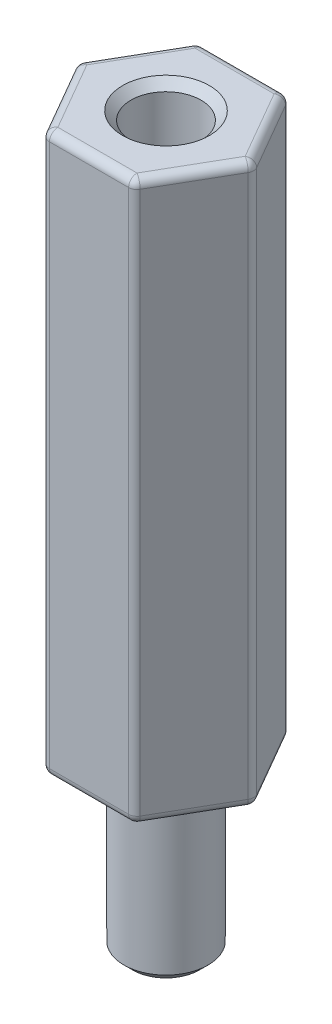
ISO-10303-21;
HEADER;
FILE_DESCRIPTION(('STEP AP214'),'2;1');
FILE_NAME('part.step','',(''),(''),'','','');
FILE_SCHEMA(('AUTOMOTIVE_DESIGN { 1 0 10303 214 1 1 1 1 }'));
ENDSEC;
DATA;
#1=APPLICATION_CONTEXT('core data for automotive mechanical design processes');
#2=APPLICATION_PROTOCOL_DEFINITION('international standard','automotive_design',2000,#1);
#3=PRODUCT_CONTEXT('',#1,'mechanical');
#4=PRODUCT('Part','Part','',(#3));
#5=PRODUCT_RELATED_PRODUCT_CATEGORY('part','',(#4));
#6=PRODUCT_DEFINITION_FORMATION('','',#4);
#7=PRODUCT_DEFINITION_CONTEXT('part definition',#1,'design');
#8=PRODUCT_DEFINITION('design','',#6,#7);
#9=PRODUCT_DEFINITION_SHAPE('','',#8);
#10=(LENGTH_UNIT() NAMED_UNIT(*) SI_UNIT(.MILLI.,.METRE.));
#11=(NAMED_UNIT(*) PLANE_ANGLE_UNIT() SI_UNIT($,.RADIAN.));
#12=(NAMED_UNIT(*) SI_UNIT($,.STERADIAN.) SOLID_ANGLE_UNIT());
#13=UNCERTAINTY_MEASURE_WITH_UNIT(LENGTH_MEASURE(1.E-05),#10,'distance_accuracy_value','');
#14=(GEOMETRIC_REPRESENTATION_CONTEXT(3) GLOBAL_UNCERTAINTY_ASSIGNED_CONTEXT((#13)) GLOBAL_UNIT_ASSIGNED_CONTEXT((#10,
#11,#12)) REPRESENTATION_CONTEXT('',''));
#15=CARTESIAN_POINT('',(0.,0.,0.));
#16=DIRECTION('',(0.,0.,1.));
#17=DIRECTION('',(1.,0.,0.));
#18=AXIS2_PLACEMENT_3D('',#15,#16,#17);
#19=CARTESIAN_POINT('',(0.,20.,0.));
#20=DIRECTION('',(0.,1.,0.));
#21=DIRECTION('',(0.,0.,1.));
#22=AXIS2_PLACEMENT_3D('',#19,#20,#21);
#23=PLANE('',#22);
#24=CARTESIAN_POINT('',(0.,20.,0.));
#25=DIRECTION('',(0.,1.,0.));
#26=DIRECTION('',(0.,0.,1.));
#27=AXIS2_PLACEMENT_3D('',#24,#25,#26);
#28=CIRCLE('',#27,1.55);
#29=CARTESIAN_POINT('',(0.,20.,1.55));
#30=VERTEX_POINT('',#29);
#31=EDGE_CURVE('E288',#30,#30,#28,.F.);
#32=ORIENTED_EDGE('',*,*,#31,.T.);
#33=EDGE_LOOP('',(#32));
#34=FACE_BOUND('',#33,.T.);
#35=DIRECTION('',(-0.5,0.,0.866025403784439));
#36=VECTOR('',#35,1.);
#37=CARTESIAN_POINT('',(-2.82901631902917,20.,0.));
#38=LINE('',#37,#36);
#39=CARTESIAN_POINT('',(-1.41450815951458,20.,-2.45));
#40=VERTEX_POINT('',#39);
#41=CARTESIAN_POINT('',(-2.82901631902917,20.,0.));
#42=VERTEX_POINT('',#41);
#43=EDGE_CURVE('E62',#40,#42,#38,.T.);
#44=ORIENTED_EDGE('',*,*,#43,.T.);
#45=DIRECTION('',(0.5,0.,0.866025403784439));
#46=VECTOR('',#45,1.);
#47=CARTESIAN_POINT('',(-1.41450815951458,20.,2.45));
#48=LINE('',#47,#46);
#49=CARTESIAN_POINT('',(-1.41450815951458,20.,2.45));
#50=VERTEX_POINT('',#49);
#51=EDGE_CURVE('E571',#42,#50,#48,.T.);
#52=ORIENTED_EDGE('',*,*,#51,.T.);
#53=DIRECTION('',(1.,0.,0.));
#54=VECTOR('',#53,1.);
#55=CARTESIAN_POINT('',(1.41450815951458,20.,2.45));
#56=LINE('',#55,#54);
#57=CARTESIAN_POINT('',(1.41450815951458,20.,2.45));
#58=VERTEX_POINT('',#57);
#59=EDGE_CURVE('E563',#50,#58,#56,.T.);
#60=ORIENTED_EDGE('',*,*,#59,.T.);
#61=DIRECTION('',(0.5,0.,-0.866025403784439));
#62=VECTOR('',#61,1.);
#63=CARTESIAN_POINT('',(2.82901631902917,20.,0.));
#64=LINE('',#63,#62);
#65=CARTESIAN_POINT('',(2.82901631902917,20.,0.));
#66=VERTEX_POINT('',#65);
#67=EDGE_CURVE('E565',#58,#66,#64,.T.);
#68=ORIENTED_EDGE('',*,*,#67,.T.);
#69=DIRECTION('',(-0.5,0.,-0.866025403784439));
#70=VECTOR('',#69,1.);
#71=CARTESIAN_POINT('',(1.41450815951459,20.,-2.45));
#72=LINE('',#71,#70);
#73=CARTESIAN_POINT('',(1.41450815951459,20.,-2.45));
#74=VERTEX_POINT('',#73);
#75=EDGE_CURVE('E567',#66,#74,#72,.T.);
#76=ORIENTED_EDGE('',*,*,#75,.T.);
#77=DIRECTION('',(-1.,0.,0.));
#78=VECTOR('',#77,1.);
#79=CARTESIAN_POINT('',(-1.41450815951458,20.,-2.45));
#80=LINE('',#79,#78);
#81=EDGE_CURVE('E67',#74,#40,#80,.T.);
#82=ORIENTED_EDGE('',*,*,#81,.T.);
#83=EDGE_LOOP('',(#44,#52,#60,#68,#76,#82));
#84=FACE_BOUND('',#83,.T.);
#85=ADVANCED_FACE('F47',(#34,#84),#23,.T.);
#86=CARTESIAN_POINT('',(0.,0.,0.));
#87=DIRECTION('',(0.,1.,0.));
#88=DIRECTION('',(0.,0.,1.));
#89=AXIS2_PLACEMENT_3D('',#86,#87,#88);
#90=PLANE('',#89);
#91=CARTESIAN_POINT('',(0.,0.,0.));
#92=DIRECTION('',(0.,1.,0.));
#93=DIRECTION('',(0.,0.,1.));
#94=AXIS2_PLACEMENT_3D('',#91,#92,#93);
#95=CIRCLE('',#94,1.8);
#96=CARTESIAN_POINT('',(0.,0.,1.8));
#97=VERTEX_POINT('',#96);
#98=EDGE_CURVE('E11',#97,#97,#95,.T.);
#99=ORIENTED_EDGE('',*,*,#98,.T.);
#100=EDGE_LOOP('',(#99));
#101=FACE_BOUND('',#100,.T.);
#102=DIRECTION('',(1.,0.,0.));
#103=VECTOR('',#102,1.);
#104=CARTESIAN_POINT('',(0.,0.,2.45));
#105=LINE('',#104,#103);
#106=CARTESIAN_POINT('',(1.41450815951458,0.,2.45));
#107=VERTEX_POINT('',#106);
#108=CARTESIAN_POINT('',(-1.41450815951458,0.,2.45));
#109=VERTEX_POINT('',#108);
#110=EDGE_CURVE('E182',#107,#109,#105,.F.);
#111=ORIENTED_EDGE('',*,*,#110,.T.);
#112=DIRECTION('',(0.5,0.,0.866025403784439));
#113=VECTOR('',#112,1.);
#114=CARTESIAN_POINT('',(-2.12176223927187,0.,1.225));
#115=LINE('',#114,#113);
#116=CARTESIAN_POINT('',(-2.82901631902917,0.,0.));
#117=VERTEX_POINT('',#116);
#118=EDGE_CURVE('E208',#109,#117,#115,.F.);
#119=ORIENTED_EDGE('',*,*,#118,.T.);
#120=DIRECTION('',(-0.5,0.,0.866025403784439));
#121=VECTOR('',#120,1.);
#122=CARTESIAN_POINT('',(-2.12176223927187,0.,-1.225));
#123=LINE('',#122,#121);
#124=CARTESIAN_POINT('',(-1.41450815951458,0.,-2.45));
#125=VERTEX_POINT('',#124);
#126=EDGE_CURVE('E524',#117,#125,#123,.F.);
#127=ORIENTED_EDGE('',*,*,#126,.T.);
#128=DIRECTION('',(-1.,0.,0.));
#129=VECTOR('',#128,1.);
#130=CARTESIAN_POINT('',(0.,0.,-2.45));
#131=LINE('',#130,#129);
#132=CARTESIAN_POINT('',(1.41450815951458,0.,-2.45));
#133=VERTEX_POINT('',#132);
#134=EDGE_CURVE('E522',#125,#133,#131,.F.);
#135=ORIENTED_EDGE('',*,*,#134,.T.);
#136=DIRECTION('',(-0.5,0.,-0.866025403784439));
#137=VECTOR('',#136,1.);
#138=CARTESIAN_POINT('',(2.12176223927188,0.,-1.225));
#139=LINE('',#138,#137);
#140=CARTESIAN_POINT('',(2.82901631902917,0.,0.));
#141=VERTEX_POINT('',#140);
#142=EDGE_CURVE('E520',#133,#141,#139,.F.);
#143=ORIENTED_EDGE('',*,*,#142,.T.);
#144=DIRECTION('',(0.5,0.,-0.866025403784439));
#145=VECTOR('',#144,1.);
#146=CARTESIAN_POINT('',(2.12176223927187,0.,1.225));
#147=LINE('',#146,#145);
#148=EDGE_CURVE('E518',#141,#107,#147,.F.);
#149=ORIENTED_EDGE('',*,*,#148,.T.);
#150=EDGE_LOOP('',(#111,#119,#127,#135,#143,#149));
#151=FACE_BOUND('',#150,.T.);
#152=ADVANCED_FACE('F307',(#101,#151),#90,.F.);
#153=CARTESIAN_POINT('',(1.58771324027147,20.,-2.75));
#154=DIRECTION('',(0.,0.,1.));
#155=DIRECTION('',(1.,0.,0.));
#156=AXIS2_PLACEMENT_3D('',#153,#154,#155);
#157=PLANE('',#156);
#158=DIRECTION('',(0.,-1.,0.));
#159=VECTOR('',#158,1.);
#160=CARTESIAN_POINT('',(1.41450815951458,20.,-2.75));
#161=LINE('',#160,#159);
#162=CARTESIAN_POINT('',(1.41450815951458,19.7,-2.75));
#163=VERTEX_POINT('',#162);
#164=CARTESIAN_POINT('',(1.41450815951458,0.300000000000002,-2.75));
#165=VERTEX_POINT('',#164);
#166=EDGE_CURVE('E487',#163,#165,#161,.T.);
#167=ORIENTED_EDGE('',*,*,#166,.T.);
#168=DIRECTION('',(-1.,0.,0.));
#169=VECTOR('',#168,1.);
#170=CARTESIAN_POINT('',(1.58771324027147,0.300000000000002,-2.75));
#171=LINE('',#170,#169);
#172=CARTESIAN_POINT('',(-1.41450815951458,0.300000000000002,-2.75));
#173=VERTEX_POINT('',#172);
#174=EDGE_CURVE('E541',#165,#173,#171,.T.);
#175=ORIENTED_EDGE('',*,*,#174,.T.);
#176=DIRECTION('',(0.,-1.,0.));
#177=VECTOR('',#176,1.);
#178=CARTESIAN_POINT('',(-1.41450815951458,20.,-2.75));
#179=LINE('',#178,#177);
#180=CARTESIAN_POINT('',(-1.41450815951458,19.7,-2.75));
#181=VERTEX_POINT('',#180);
#182=EDGE_CURVE('E484',#173,#181,#179,.F.);
#183=ORIENTED_EDGE('',*,*,#182,.T.);
#184=DIRECTION('',(-1.,0.,0.));
#185=VECTOR('',#184,1.);
#186=CARTESIAN_POINT('',(1.41450815951458,19.7,-2.75));
#187=LINE('',#186,#185);
#188=EDGE_CURVE('E539',#181,#163,#187,.F.);
#189=ORIENTED_EDGE('',*,*,#188,.T.);
#190=EDGE_LOOP('',(#167,#175,#183,#189));
#191=FACE_BOUND('',#190,.T.);
#192=ADVANCED_FACE('F315',(#191),#157,.F.);
#193=CARTESIAN_POINT('',(-1.58771324027147,20.,-2.75));
#194=DIRECTION('',(0.866025403784439,0.,0.5));
#195=DIRECTION('',(0.5,0.,-0.866025403784439));
#196=AXIS2_PLACEMENT_3D('',#193,#194,#195);
#197=PLANE('',#196);
#198=DIRECTION('',(0.,-1.,0.));
#199=VECTOR('',#198,1.);
#200=CARTESIAN_POINT('',(-1.67431578064991,20.,-2.6));
#201=LINE('',#200,#199);
#202=CARTESIAN_POINT('',(-1.67431578064991,19.7,-2.6));
#203=VERTEX_POINT('',#202);
#204=CARTESIAN_POINT('',(-1.67431578064991,0.300000000000002,-2.6));
#205=VERTEX_POINT('',#204);
#206=EDGE_CURVE('E195',#203,#205,#201,.T.);
#207=ORIENTED_EDGE('',*,*,#206,.T.);
#208=DIRECTION('',(-0.5,0.,0.866025403784439));
#209=VECTOR('',#208,1.);
#210=CARTESIAN_POINT('',(-1.58771324027147,0.300000000000002,-2.75));
#211=LINE('',#210,#209);
#212=CARTESIAN_POINT('',(-3.0888239401645,0.300000000000002,-0.15));
#213=VERTEX_POINT('',#212);
#214=EDGE_CURVE('E533',#205,#213,#211,.T.);
#215=ORIENTED_EDGE('',*,*,#214,.T.);
#216=DIRECTION('',(0.,-1.,0.));
#217=VECTOR('',#216,1.);
#218=CARTESIAN_POINT('',(-3.0888239401645,20.,-0.15));
#219=LINE('',#218,#217);
#220=CARTESIAN_POINT('',(-3.0888239401645,19.7,-0.15));
#221=VERTEX_POINT('',#220);
#222=EDGE_CURVE('E504',#213,#221,#219,.F.);
#223=ORIENTED_EDGE('',*,*,#222,.T.);
#224=DIRECTION('',(-0.5,0.,0.866025403784439));
#225=VECTOR('',#224,1.);
#226=CARTESIAN_POINT('',(-1.67431578064991,19.7,-2.6));
#227=LINE('',#226,#225);
#228=EDGE_CURVE('E531',#221,#203,#227,.F.);
#229=ORIENTED_EDGE('',*,*,#228,.T.);
#230=EDGE_LOOP('',(#207,#215,#223,#229));
#231=FACE_BOUND('',#230,.T.);
#232=ADVANCED_FACE('F336',(#231),#197,.F.);
#233=CARTESIAN_POINT('',(-3.17542648054294,20.,0.));
#234=DIRECTION('',(0.866025403784439,0.,-0.5));
#235=DIRECTION('',(-0.5,0.,-0.866025403784439));
#236=AXIS2_PLACEMENT_3D('',#233,#234,#235);
#237=PLANE('',#236);
#238=DIRECTION('',(0.,-1.,0.));
#239=VECTOR('',#238,1.);
#240=CARTESIAN_POINT('',(-3.0888239401645,20.,0.149999999999999));
#241=LINE('',#240,#239);
#242=CARTESIAN_POINT('',(-3.0888239401645,19.7,0.149999999999999));
#243=VERTEX_POINT('',#242);
#244=CARTESIAN_POINT('',(-3.0888239401645,0.300000000000002,0.149999999999999));
#245=VERTEX_POINT('',#244);
#246=EDGE_CURVE('E178',#243,#245,#241,.T.);
#247=ORIENTED_EDGE('',*,*,#246,.T.);
#248=DIRECTION('',(0.5,0.,0.866025403784439));
#249=VECTOR('',#248,1.);
#250=CARTESIAN_POINT('',(-3.17542648054294,0.300000000000002,0.));
#251=LINE('',#250,#249);
#252=CARTESIAN_POINT('',(-1.67431578064992,0.300000000000002,2.6));
#253=VERTEX_POINT('',#252);
#254=EDGE_CURVE('E173',#245,#253,#251,.T.);
#255=ORIENTED_EDGE('',*,*,#254,.T.);
#256=DIRECTION('',(0.,-1.,0.));
#257=VECTOR('',#256,1.);
#258=CARTESIAN_POINT('',(-1.67431578064992,20.,2.6));
#259=LINE('',#258,#257);
#260=CARTESIAN_POINT('',(-1.67431578064992,19.7,2.6));
#261=VERTEX_POINT('',#260);
#262=EDGE_CURVE('E176',#253,#261,#259,.F.);
#263=ORIENTED_EDGE('',*,*,#262,.T.);
#264=DIRECTION('',(0.5,0.,0.866025403784439));
#265=VECTOR('',#264,1.);
#266=CARTESIAN_POINT('',(-3.0888239401645,19.7,0.149999999999999));
#267=LINE('',#266,#265);
#268=EDGE_CURVE('E183',#261,#243,#267,.F.);
#269=ORIENTED_EDGE('',*,*,#268,.T.);
#270=EDGE_LOOP('',(#247,#255,#263,#269));
#271=FACE_BOUND('',#270,.T.);
#272=ADVANCED_FACE('F175',(#271),#237,.F.);
#273=CARTESIAN_POINT('',(-1.58771324027147,20.,2.75));
#274=DIRECTION('',(0.,0.,-1.));
#275=DIRECTION('',(-1.,0.,0.));
#276=AXIS2_PLACEMENT_3D('',#273,#274,#275);
#277=PLANE('',#276);
#278=DIRECTION('',(0.,-1.,0.));
#279=VECTOR('',#278,1.);
#280=CARTESIAN_POINT('',(-1.41450815951458,20.,2.75));
#281=LINE('',#280,#279);
#282=CARTESIAN_POINT('',(-1.41450815951458,19.7,2.75));
#283=VERTEX_POINT('',#282);
#284=CARTESIAN_POINT('',(-1.41450815951458,0.300000000000002,2.75));
#285=VERTEX_POINT('',#284);
#286=EDGE_CURVE('E513',#283,#285,#281,.T.);
#287=ORIENTED_EDGE('',*,*,#286,.T.);
#288=DIRECTION('',(1.,0.,0.));
#289=VECTOR('',#288,1.);
#290=CARTESIAN_POINT('',(-1.58771324027147,0.300000000000002,2.75));
#291=LINE('',#290,#289);
#292=CARTESIAN_POINT('',(1.41450815951458,0.300000000000002,2.75));
#293=VERTEX_POINT('',#292);
#294=EDGE_CURVE('E217',#285,#293,#291,.T.);
#295=ORIENTED_EDGE('',*,*,#294,.T.);
#296=DIRECTION('',(0.,-1.,0.));
#297=VECTOR('',#296,1.);
#298=CARTESIAN_POINT('',(1.41450815951458,20.,2.75));
#299=LINE('',#298,#297);
#300=CARTESIAN_POINT('',(1.41450815951458,19.7,2.75));
#301=VERTEX_POINT('',#300);
#302=EDGE_CURVE('E510',#293,#301,#299,.F.);
#303=ORIENTED_EDGE('',*,*,#302,.T.);
#304=DIRECTION('',(1.,0.,0.));
#305=VECTOR('',#304,1.);
#306=CARTESIAN_POINT('',(-1.41450815951458,19.7,2.75));
#307=LINE('',#306,#305);
#308=EDGE_CURVE('E572',#301,#283,#307,.F.);
#309=ORIENTED_EDGE('',*,*,#308,.T.);
#310=EDGE_LOOP('',(#287,#295,#303,#309));
#311=FACE_BOUND('',#310,.T.);
#312=ADVANCED_FACE('F329',(#311),#277,.F.);
#313=CARTESIAN_POINT('',(1.58771324027147,20.,2.75));
#314=DIRECTION('',(-0.866025403784439,0.,-0.5));
#315=DIRECTION('',(-0.5,0.,0.866025403784439));
#316=AXIS2_PLACEMENT_3D('',#313,#314,#315);
#317=PLANE('',#316);
#318=DIRECTION('',(0.,-1.,0.));
#319=VECTOR('',#318,1.);
#320=CARTESIAN_POINT('',(1.67431578064991,20.,2.6));
#321=LINE('',#320,#319);
#322=CARTESIAN_POINT('',(1.67431578064991,19.7,2.6));
#323=VERTEX_POINT('',#322);
#324=CARTESIAN_POINT('',(1.67431578064991,0.300000000000002,2.6));
#325=VERTEX_POINT('',#324);
#326=EDGE_CURVE('E498',#323,#325,#321,.T.);
#327=ORIENTED_EDGE('',*,*,#326,.T.);
#328=DIRECTION('',(0.5,0.,-0.866025403784439));
#329=VECTOR('',#328,1.);
#330=CARTESIAN_POINT('',(1.58771324027147,0.300000000000002,2.75));
#331=LINE('',#330,#329);
#332=CARTESIAN_POINT('',(3.0888239401645,0.300000000000002,0.149999999999998));
#333=VERTEX_POINT('',#332);
#334=EDGE_CURVE('E557',#325,#333,#331,.T.);
#335=ORIENTED_EDGE('',*,*,#334,.T.);
#336=DIRECTION('',(0.,-1.,0.));
#337=VECTOR('',#336,1.);
#338=CARTESIAN_POINT('',(3.0888239401645,20.,0.149999999999998));
#339=LINE('',#338,#337);
#340=CARTESIAN_POINT('',(3.0888239401645,19.7,0.149999999999998));
#341=VERTEX_POINT('',#340);
#342=EDGE_CURVE('E501',#333,#341,#339,.F.);
#343=ORIENTED_EDGE('',*,*,#342,.T.);
#344=DIRECTION('',(0.5,0.,-0.866025403784439));
#345=VECTOR('',#344,1.);
#346=CARTESIAN_POINT('',(1.67431578064991,19.7,2.6));
#347=LINE('',#346,#345);
#348=EDGE_CURVE('E555',#341,#323,#347,.F.);
#349=ORIENTED_EDGE('',*,*,#348,.T.);
#350=EDGE_LOOP('',(#327,#335,#343,#349));
#351=FACE_BOUND('',#350,.T.);
#352=ADVANCED_FACE('F325',(#351),#317,.F.);
#353=CARTESIAN_POINT('',(3.17542648054294,20.,0.));
#354=DIRECTION('',(-0.866025403784439,0.,0.5));
#355=DIRECTION('',(0.5,0.,0.866025403784439));
#356=AXIS2_PLACEMENT_3D('',#353,#354,#355);
#357=PLANE('',#356);
#358=DIRECTION('',(0.,-1.,0.));
#359=VECTOR('',#358,1.);
#360=CARTESIAN_POINT('',(3.0888239401645,20.,-0.150000000000002));
#361=LINE('',#360,#359);
#362=CARTESIAN_POINT('',(3.0888239401645,19.7,-0.150000000000002));
#363=VERTEX_POINT('',#362);
#364=CARTESIAN_POINT('',(3.0888239401645,0.300000000000002,-0.150000000000002));
#365=VERTEX_POINT('',#364);
#366=EDGE_CURVE('E492',#363,#365,#361,.T.);
#367=ORIENTED_EDGE('',*,*,#366,.T.);
#368=DIRECTION('',(-0.5,0.,-0.866025403784439));
#369=VECTOR('',#368,1.);
#370=CARTESIAN_POINT('',(3.17542648054294,0.300000000000002,0.));
#371=LINE('',#370,#369);
#372=CARTESIAN_POINT('',(1.67431578064992,0.300000000000002,-2.6));
#373=VERTEX_POINT('',#372);
#374=EDGE_CURVE('E549',#365,#373,#371,.T.);
#375=ORIENTED_EDGE('',*,*,#374,.T.);
#376=DIRECTION('',(0.,-1.,0.));
#377=VECTOR('',#376,1.);
#378=CARTESIAN_POINT('',(1.67431578064992,20.,-2.6));
#379=LINE('',#378,#377);
#380=CARTESIAN_POINT('',(1.67431578064992,19.7,-2.6));
#381=VERTEX_POINT('',#380);
#382=EDGE_CURVE('E495',#373,#381,#379,.F.);
#383=ORIENTED_EDGE('',*,*,#382,.T.);
#384=DIRECTION('',(-0.5,0.,-0.866025403784439));
#385=VECTOR('',#384,1.);
#386=CARTESIAN_POINT('',(3.0888239401645,19.7,-0.150000000000002));
#387=LINE('',#386,#385);
#388=EDGE_CURVE('E547',#381,#363,#387,.F.);
#389=ORIENTED_EDGE('',*,*,#388,.T.);
#390=EDGE_LOOP('',(#367,#375,#383,#389));
#391=FACE_BOUND('',#390,.T.);
#392=ADVANCED_FACE('F322',(#391),#357,.F.);
#393=CARTESIAN_POINT('',(0.,20.,0.));
#394=DIRECTION('',(0.,-1.,0.));
#395=DIRECTION('',(0.,0.,-1.));
#396=AXIS2_PLACEMENT_3D('',#393,#394,#395);
#397=CYLINDRICAL_SURFACE('',#396,1.25);
#398=CARTESIAN_POINT('',(0.,19.7,0.));
#399=DIRECTION('',(0.,1.,0.));
#400=DIRECTION('',(0.,0.,1.));
#401=AXIS2_PLACEMENT_3D('',#398,#399,#400);
#402=CIRCLE('',#401,1.25);
#403=CARTESIAN_POINT('',(0.,19.7,1.25));
#404=VERTEX_POINT('',#403);
#405=EDGE_CURVE('E285',#404,#404,#402,.T.);
#406=ORIENTED_EDGE('',*,*,#405,.T.);
#407=EDGE_LOOP('',(#406));
#408=FACE_BOUND('',#407,.T.);
#409=CARTESIAN_POINT('',(0.,0.,0.));
#410=DIRECTION('',(0.,1.,0.));
#411=DIRECTION('',(0.,0.,1.));
#412=AXIS2_PLACEMENT_3D('',#409,#410,#411);
#413=CIRCLE('',#412,1.25);
#414=CARTESIAN_POINT('',(0.,0.,1.25));
#415=VERTEX_POINT('',#414);
#416=EDGE_CURVE('E248',#415,#415,#413,.T.);
#417=ORIENTED_EDGE('',*,*,#416,.F.);
#418=EDGE_LOOP('',(#417));
#419=FACE_BOUND('',#418,.T.);
#420=ADVANCED_FACE('F319',(#408,#419),#397,.F.);
#421=CARTESIAN_POINT('',(1.41450815951458,20.,-2.45));
#422=DIRECTION('',(0.,-1.,0.));
#423=DIRECTION('',(0.,0.,-1.));
#424=AXIS2_PLACEMENT_3D('',#421,#422,#423);
#425=CYLINDRICAL_SURFACE('',#424,0.3);
#426=ORIENTED_EDGE('',*,*,#382,.F.);
#427=CARTESIAN_POINT('',(1.41450815951458,0.300000000000002,-2.45));
#428=DIRECTION('',(0.,-1.,0.));
#429=DIRECTION('',(0.,0.,-1.));
#430=AXIS2_PLACEMENT_3D('',#427,#428,#429);
#431=CIRCLE('',#430,0.3);
#432=EDGE_CURVE('E545',#373,#165,#431,.F.);
#433=ORIENTED_EDGE('',*,*,#432,.T.);
#434=ORIENTED_EDGE('',*,*,#166,.F.);
#435=CARTESIAN_POINT('',(1.41450815951458,19.7,-2.45));
#436=DIRECTION('',(0.,-1.,0.));
#437=DIRECTION('',(0.,0.,-1.));
#438=AXIS2_PLACEMENT_3D('',#435,#436,#437);
#439=CIRCLE('',#438,0.3);
#440=EDGE_CURVE('E543',#163,#381,#439,.T.);
#441=ORIENTED_EDGE('',*,*,#440,.T.);
#442=EDGE_LOOP('',(#426,#433,#434,#441));
#443=FACE_BOUND('',#442,.T.);
#444=ADVANCED_FACE('F343',(#443),#425,.T.);
#445=CARTESIAN_POINT('',(2.82901631902917,20.,0.));
#446=DIRECTION('',(0.,-1.,0.));
#447=DIRECTION('',(0.,0.,-1.));
#448=AXIS2_PLACEMENT_3D('',#445,#446,#447);
#449=CYLINDRICAL_SURFACE('',#448,0.3);
#450=ORIENTED_EDGE('',*,*,#342,.F.);
#451=CARTESIAN_POINT('',(2.82901631902917,0.300000000000002,0.));
#452=DIRECTION('',(0.,-1.,0.));
#453=DIRECTION('',(0.,0.,-1.));
#454=AXIS2_PLACEMENT_3D('',#451,#452,#453);
#455=CIRCLE('',#454,0.3);
#456=EDGE_CURVE('E553',#333,#365,#455,.F.);
#457=ORIENTED_EDGE('',*,*,#456,.T.);
#458=ORIENTED_EDGE('',*,*,#366,.F.);
#459=CARTESIAN_POINT('',(2.82901631902917,19.7,0.));
#460=DIRECTION('',(0.,-1.,0.));
#461=DIRECTION('',(0.,0.,-1.));
#462=AXIS2_PLACEMENT_3D('',#459,#460,#461);
#463=CIRCLE('',#462,0.3);
#464=EDGE_CURVE('E551',#363,#341,#463,.T.);
#465=ORIENTED_EDGE('',*,*,#464,.T.);
#466=EDGE_LOOP('',(#450,#457,#458,#465));
#467=FACE_BOUND('',#466,.T.);
#468=ADVANCED_FACE('F346',(#467),#449,.T.);
#469=CARTESIAN_POINT('',(-1.41450815951458,20.,-2.45));
#470=DIRECTION('',(0.,-1.,0.));
#471=DIRECTION('',(0.,0.,-1.));
#472=AXIS2_PLACEMENT_3D('',#469,#470,#471);
#473=CYLINDRICAL_SURFACE('',#472,0.3);
#474=ORIENTED_EDGE('',*,*,#182,.F.);
#475=CARTESIAN_POINT('',(-1.41450815951458,0.300000000000002,-2.45));
#476=DIRECTION('',(0.,-1.,0.));
#477=DIRECTION('',(0.,0.,-1.));
#478=AXIS2_PLACEMENT_3D('',#475,#476,#477);
#479=CIRCLE('',#478,0.3);
#480=EDGE_CURVE('E537',#173,#205,#479,.F.);
#481=ORIENTED_EDGE('',*,*,#480,.T.);
#482=ORIENTED_EDGE('',*,*,#206,.F.);
#483=CARTESIAN_POINT('',(-1.41450815951458,19.7,-2.45));
#484=DIRECTION('',(0.,-1.,0.));
#485=DIRECTION('',(0.,0.,-1.));
#486=AXIS2_PLACEMENT_3D('',#483,#484,#485);
#487=CIRCLE('',#486,0.3);
#488=EDGE_CURVE('E535',#203,#181,#487,.T.);
#489=ORIENTED_EDGE('',*,*,#488,.T.);
#490=EDGE_LOOP('',(#474,#481,#482,#489));
#491=FACE_BOUND('',#490,.T.);
#492=ADVANCED_FACE('F350',(#491),#473,.T.);
#493=CARTESIAN_POINT('',(-2.82901631902917,20.,0.));
#494=DIRECTION('',(0.,-1.,0.));
#495=DIRECTION('',(0.,0.,-1.));
#496=AXIS2_PLACEMENT_3D('',#493,#494,#495);
#497=CYLINDRICAL_SURFACE('',#496,0.3);
#498=ORIENTED_EDGE('',*,*,#222,.F.);
#499=CARTESIAN_POINT('',(-2.82901631902917,0.300000000000002,0.));
#500=DIRECTION('',(0.,-1.,0.));
#501=DIRECTION('',(0.,0.,-1.));
#502=AXIS2_PLACEMENT_3D('',#499,#500,#501);
#503=CIRCLE('',#502,0.3);
#504=EDGE_CURVE('E529',#213,#245,#503,.F.);
#505=ORIENTED_EDGE('',*,*,#504,.T.);
#506=ORIENTED_EDGE('',*,*,#246,.F.);
#507=CARTESIAN_POINT('',(-2.82901631902917,19.7,0.));
#508=DIRECTION('',(0.,-1.,0.));
#509=DIRECTION('',(0.,0.,-1.));
#510=AXIS2_PLACEMENT_3D('',#507,#508,#509);
#511=CIRCLE('',#510,0.3);
#512=EDGE_CURVE('E527',#243,#221,#511,.T.);
#513=ORIENTED_EDGE('',*,*,#512,.T.);
#514=EDGE_LOOP('',(#498,#505,#506,#513));
#515=FACE_BOUND('',#514,.T.);
#516=ADVANCED_FACE('F354',(#515),#497,.T.);
#517=CARTESIAN_POINT('',(-1.41450815951458,20.,2.45));
#518=DIRECTION('',(0.,-1.,0.));
#519=DIRECTION('',(0.,0.,-1.));
#520=AXIS2_PLACEMENT_3D('',#517,#518,#519);
#521=CYLINDRICAL_SURFACE('',#520,0.3);
#522=ORIENTED_EDGE('',*,*,#262,.F.);
#523=CARTESIAN_POINT('',(-1.41450815951458,0.300000000000002,2.45));
#524=DIRECTION('',(0.,-1.,0.));
#525=DIRECTION('',(0.,0.,-1.));
#526=AXIS2_PLACEMENT_3D('',#523,#524,#525);
#527=CIRCLE('',#526,0.3);
#528=EDGE_CURVE('E191',#253,#285,#527,.F.);
#529=ORIENTED_EDGE('',*,*,#528,.T.);
#530=ORIENTED_EDGE('',*,*,#286,.F.);
#531=CARTESIAN_POINT('',(-1.41450815951458,19.7,2.45));
#532=DIRECTION('',(0.,-1.,0.));
#533=DIRECTION('',(0.,0.,-1.));
#534=AXIS2_PLACEMENT_3D('',#531,#532,#533);
#535=CIRCLE('',#534,0.3);
#536=EDGE_CURVE('E194',#283,#261,#535,.T.);
#537=ORIENTED_EDGE('',*,*,#536,.T.);
#538=EDGE_LOOP('',(#522,#529,#530,#537));
#539=FACE_BOUND('',#538,.T.);
#540=ADVANCED_FACE('F189',(#539),#521,.T.);
#541=CARTESIAN_POINT('',(1.41450815951458,20.,2.45));
#542=DIRECTION('',(0.,-1.,0.));
#543=DIRECTION('',(0.,0.,-1.));
#544=AXIS2_PLACEMENT_3D('',#541,#542,#543);
#545=CYLINDRICAL_SURFACE('',#544,0.3);
#546=ORIENTED_EDGE('',*,*,#302,.F.);
#547=CARTESIAN_POINT('',(1.41450815951458,0.300000000000002,2.45));
#548=DIRECTION('',(0.,-1.,0.));
#549=DIRECTION('',(0.,0.,-1.));
#550=AXIS2_PLACEMENT_3D('',#547,#548,#549);
#551=CIRCLE('',#550,0.3);
#552=EDGE_CURVE('E561',#293,#325,#551,.F.);
#553=ORIENTED_EDGE('',*,*,#552,.T.);
#554=ORIENTED_EDGE('',*,*,#326,.F.);
#555=CARTESIAN_POINT('',(1.41450815951458,19.7,2.45));
#556=DIRECTION('',(0.,-1.,0.));
#557=DIRECTION('',(0.,0.,-1.));
#558=AXIS2_PLACEMENT_3D('',#555,#556,#557);
#559=CIRCLE('',#558,0.3);
#560=EDGE_CURVE('E559',#323,#301,#559,.T.);
#561=ORIENTED_EDGE('',*,*,#560,.T.);
#562=EDGE_LOOP('',(#546,#553,#554,#561));
#563=FACE_BOUND('',#562,.T.);
#564=ADVANCED_FACE('F361',(#563),#545,.T.);
#565=CARTESIAN_POINT('',(1.41450815951458,0.300000000000002,-2.45));
#566=DIRECTION('',(0.,1.,0.));
#567=DIRECTION('',(0.,0.,1.));
#568=AXIS2_PLACEMENT_3D('',#565,#566,#567);
#569=SPHERICAL_SURFACE('',#568,0.3);
#570=CARTESIAN_POINT('',(1.41450815951458,0.300000000000002,-2.45));
#571=DIRECTION('',(-1.,0.,0.));
#572=DIRECTION('',(0.,0.,1.));
#573=AXIS2_PLACEMENT_3D('',#570,#571,#572);
#574=CIRCLE('',#573,0.3);
#575=EDGE_CURVE('E242',#165,#133,#574,.T.);
#576=ORIENTED_EDGE('',*,*,#575,.F.);
#577=ORIENTED_EDGE('',*,*,#432,.F.);
#578=CARTESIAN_POINT('',(1.41450815951458,0.300000000000001,-2.45));
#579=DIRECTION('',(0.499999999999999,0.,0.866025403784439));
#580=DIRECTION('',(0.866025403784439,0.,-0.499999999999999));
#581=AXIS2_PLACEMENT_3D('',#578,#579,#580);
#582=CIRCLE('',#581,0.3);
#583=EDGE_CURVE('E245',#133,#373,#582,.T.);
#584=ORIENTED_EDGE('',*,*,#583,.F.);
#585=EDGE_LOOP('',(#576,#577,#584));
#586=FACE_BOUND('',#585,.T.);
#587=ADVANCED_FACE('F364',(#586),#569,.T.);
#588=CARTESIAN_POINT('',(2.91561885940761,0.300000000000002,0.149999999999998));
#589=DIRECTION('',(-0.5,0.,-0.866025403784439));
#590=DIRECTION('',(-0.866025403784439,0.,0.5));
#591=AXIS2_PLACEMENT_3D('',#588,#589,#590);
#592=CYLINDRICAL_SURFACE('',#591,0.3);
#593=ORIENTED_EDGE('',*,*,#583,.T.);
#594=ORIENTED_EDGE('',*,*,#374,.F.);
#595=CARTESIAN_POINT('',(2.82901631902917,0.3,0.));
#596=DIRECTION('',(0.5,0.,0.866025403784439));
#597=DIRECTION('',(0.866025403784439,0.,-0.5));
#598=AXIS2_PLACEMENT_3D('',#595,#596,#597);
#599=CIRCLE('',#598,0.3);
#600=EDGE_CURVE('E239',#141,#365,#599,.T.);
#601=ORIENTED_EDGE('',*,*,#600,.F.);
#602=ORIENTED_EDGE('',*,*,#142,.F.);
#603=EDGE_LOOP('',(#593,#594,#601,#602));
#604=FACE_BOUND('',#603,.T.);
#605=ADVANCED_FACE('F402',(#604),#592,.T.);
#606=CARTESIAN_POINT('',(1.58771324027147,0.300000000000002,-2.45));
#607=DIRECTION('',(-1.,0.,0.));
#608=DIRECTION('',(0.,0.,1.));
#609=AXIS2_PLACEMENT_3D('',#606,#607,#608);
#610=CYLINDRICAL_SURFACE('',#609,0.3);
#611=ORIENTED_EDGE('',*,*,#575,.T.);
#612=ORIENTED_EDGE('',*,*,#134,.F.);
#613=CARTESIAN_POINT('',(-1.41450815951458,0.300000000000002,-2.45));
#614=DIRECTION('',(-1.,0.,0.));
#615=DIRECTION('',(0.,-1.,0.));
#616=AXIS2_PLACEMENT_3D('',#613,#614,#615);
#617=CIRCLE('',#616,0.3);
#618=EDGE_CURVE('E236',#173,#125,#617,.T.);
#619=ORIENTED_EDGE('',*,*,#618,.F.);
#620=ORIENTED_EDGE('',*,*,#174,.F.);
#621=EDGE_LOOP('',(#611,#612,#619,#620));
#622=FACE_BOUND('',#621,.T.);
#623=ADVANCED_FACE('F398',(#622),#610,.T.);
#624=CARTESIAN_POINT('',(2.82901631902917,0.300000000000002,0.));
#625=DIRECTION('',(0.,1.,0.));
#626=DIRECTION('',(0.,0.,1.));
#627=AXIS2_PLACEMENT_3D('',#624,#625,#626);
#628=SPHERICAL_SURFACE('',#627,0.3);
#629=ORIENTED_EDGE('',*,*,#600,.T.);
#630=ORIENTED_EDGE('',*,*,#456,.F.);
#631=CARTESIAN_POINT('',(2.82901631902917,0.300000000000001,0.));
#632=DIRECTION('',(-0.5,0.,0.866025403784439));
#633=DIRECTION('',(0.866025403784439,0.,0.5));
#634=AXIS2_PLACEMENT_3D('',#631,#632,#633);
#635=CIRCLE('',#634,0.3);
#636=EDGE_CURVE('E233',#141,#333,#635,.T.);
#637=ORIENTED_EDGE('',*,*,#636,.F.);
#638=EDGE_LOOP('',(#629,#630,#637));
#639=FACE_BOUND('',#638,.T.);
#640=ADVANCED_FACE('F394',(#639),#628,.T.);
#641=CARTESIAN_POINT('',(-1.41450815951458,0.300000000000002,-2.45));
#642=DIRECTION('',(0.,1.,0.));
#643=DIRECTION('',(0.,0.,1.));
#644=AXIS2_PLACEMENT_3D('',#641,#642,#643);
#645=SPHERICAL_SURFACE('',#644,0.3);
#646=ORIENTED_EDGE('',*,*,#480,.F.);
#647=ORIENTED_EDGE('',*,*,#618,.T.);
#648=CARTESIAN_POINT('',(-1.41450815951458,0.300000000000002,-2.45));
#649=DIRECTION('',(-0.5,0.,0.866025403784439));
#650=DIRECTION('',(0.866025403784439,0.,0.5));
#651=AXIS2_PLACEMENT_3D('',#648,#649,#650);
#652=CIRCLE('',#651,0.3);
#653=EDGE_CURVE('E230',#205,#125,#652,.T.);
#654=ORIENTED_EDGE('',*,*,#653,.F.);
#655=EDGE_LOOP('',(#646,#647,#654));
#656=FACE_BOUND('',#655,.T.);
#657=ADVANCED_FACE('F390',(#656),#645,.T.);
#658=CARTESIAN_POINT('',(1.32790561913614,0.300000000000002,2.6));
#659=DIRECTION('',(0.5,0.,-0.866025403784439));
#660=DIRECTION('',(-0.866025403784439,0.,-0.5));
#661=AXIS2_PLACEMENT_3D('',#658,#659,#660);
#662=CYLINDRICAL_SURFACE('',#661,0.3);
#663=ORIENTED_EDGE('',*,*,#636,.T.);
#664=ORIENTED_EDGE('',*,*,#334,.F.);
#665=CARTESIAN_POINT('',(1.41450815951458,0.3,2.45));
#666=DIRECTION('',(-0.5,0.,0.866025403784439));
#667=DIRECTION('',(0.866025403784439,0.,0.5));
#668=AXIS2_PLACEMENT_3D('',#665,#666,#667);
#669=CIRCLE('',#668,0.3);
#670=EDGE_CURVE('E227',#107,#325,#669,.T.);
#671=ORIENTED_EDGE('',*,*,#670,.F.);
#672=ORIENTED_EDGE('',*,*,#148,.F.);
#673=EDGE_LOOP('',(#663,#664,#671,#672));
#674=FACE_BOUND('',#673,.T.);
#675=ADVANCED_FACE('F386',(#674),#662,.T.);
#676=CARTESIAN_POINT('',(-1.32790561913614,0.300000000000002,-2.6));
#677=DIRECTION('',(-0.5,0.,0.866025403784439));
#678=DIRECTION('',(0.866025403784439,0.,0.5));
#679=AXIS2_PLACEMENT_3D('',#676,#677,#678);
#680=CYLINDRICAL_SURFACE('',#679,0.3);
#681=ORIENTED_EDGE('',*,*,#653,.T.);
#682=ORIENTED_EDGE('',*,*,#126,.F.);
#683=CARTESIAN_POINT('',(-2.82901631902917,0.300000000000002,0.));
#684=DIRECTION('',(-0.5,0.,0.866025403784438));
#685=DIRECTION('',(0.866025403784438,0.,0.5));
#686=AXIS2_PLACEMENT_3D('',#683,#684,#685);
#687=CIRCLE('',#686,0.3);
#688=EDGE_CURVE('E224',#213,#117,#687,.T.);
#689=ORIENTED_EDGE('',*,*,#688,.F.);
#690=ORIENTED_EDGE('',*,*,#214,.F.);
#691=EDGE_LOOP('',(#681,#682,#689,#690));
#692=FACE_BOUND('',#691,.T.);
#693=ADVANCED_FACE('F382',(#692),#680,.T.);
#694=CARTESIAN_POINT('',(1.41450815951458,0.300000000000002,2.45));
#695=DIRECTION('',(0.,1.,0.));
#696=DIRECTION('',(0.,0.,1.));
#697=AXIS2_PLACEMENT_3D('',#694,#695,#696);
#698=SPHERICAL_SURFACE('',#697,0.3);
#699=ORIENTED_EDGE('',*,*,#670,.T.);
#700=ORIENTED_EDGE('',*,*,#552,.F.);
#701=CARTESIAN_POINT('',(1.41450815951458,0.300000000000001,2.45));
#702=DIRECTION('',(-1.,0.,0.));
#703=DIRECTION('',(0.,0.,1.));
#704=AXIS2_PLACEMENT_3D('',#701,#702,#703);
#705=CIRCLE('',#704,0.3);
#706=EDGE_CURVE('E221',#107,#293,#705,.T.);
#707=ORIENTED_EDGE('',*,*,#706,.F.);
#708=EDGE_LOOP('',(#699,#700,#707));
#709=FACE_BOUND('',#708,.T.);
#710=ADVANCED_FACE('F378',(#709),#698,.T.);
#711=CARTESIAN_POINT('',(-2.82901631902917,0.300000000000002,0.));
#712=DIRECTION('',(0.,1.,0.));
#713=DIRECTION('',(0.,0.,1.));
#714=AXIS2_PLACEMENT_3D('',#711,#712,#713);
#715=SPHERICAL_SURFACE('',#714,0.3);
#716=ORIENTED_EDGE('',*,*,#504,.F.);
#717=ORIENTED_EDGE('',*,*,#688,.T.);
#718=CARTESIAN_POINT('',(-2.82901631902917,0.300000000000002,0.));
#719=DIRECTION('',(0.5,0.,0.866025403784438));
#720=DIRECTION('',(0.866025403784439,0.,-0.5));
#721=AXIS2_PLACEMENT_3D('',#718,#719,#720);
#722=CIRCLE('',#721,0.3);
#723=EDGE_CURVE('E211',#245,#117,#722,.T.);
#724=ORIENTED_EDGE('',*,*,#723,.F.);
#725=EDGE_LOOP('',(#716,#717,#724));
#726=FACE_BOUND('',#725,.T.);
#727=ADVANCED_FACE('F374',(#726),#715,.T.);
#728=CARTESIAN_POINT('',(-1.58771324027147,0.300000000000002,2.45));
#729=DIRECTION('',(1.,0.,0.));
#730=DIRECTION('',(0.,0.,-1.));
#731=AXIS2_PLACEMENT_3D('',#728,#729,#730);
#732=CYLINDRICAL_SURFACE('',#731,0.3);
#733=ORIENTED_EDGE('',*,*,#706,.T.);
#734=ORIENTED_EDGE('',*,*,#294,.F.);
#735=CARTESIAN_POINT('',(-1.41450815951458,0.3,2.45));
#736=DIRECTION('',(-1.,0.,0.));
#737=DIRECTION('',(0.,0.,1.));
#738=AXIS2_PLACEMENT_3D('',#735,#736,#737);
#739=CIRCLE('',#738,0.3);
#740=EDGE_CURVE('E202',#109,#285,#739,.T.);
#741=ORIENTED_EDGE('',*,*,#740,.F.);
#742=ORIENTED_EDGE('',*,*,#110,.F.);
#743=EDGE_LOOP('',(#733,#734,#741,#742));
#744=FACE_BOUND('',#743,.T.);
#745=ADVANCED_FACE('F371',(#744),#732,.T.);
#746=CARTESIAN_POINT('',(-2.91561885940761,0.300000000000002,-0.150000000000001));
#747=DIRECTION('',(0.5,0.,0.866025403784439));
#748=DIRECTION('',(0.866025403784439,0.,-0.5));
#749=AXIS2_PLACEMENT_3D('',#746,#747,#748);
#750=CYLINDRICAL_SURFACE('',#749,0.3);
#751=ORIENTED_EDGE('',*,*,#723,.T.);
#752=ORIENTED_EDGE('',*,*,#118,.F.);
#753=CARTESIAN_POINT('',(-1.41450815951458,0.300000000000002,2.45));
#754=DIRECTION('',(0.5,0.,0.866025403784439));
#755=DIRECTION('',(0.866025403784439,0.,-0.5));
#756=AXIS2_PLACEMENT_3D('',#753,#754,#755);
#757=CIRCLE('',#756,0.3);
#758=EDGE_CURVE('E200',#253,#109,#757,.T.);
#759=ORIENTED_EDGE('',*,*,#758,.F.);
#760=ORIENTED_EDGE('',*,*,#254,.F.);
#761=EDGE_LOOP('',(#751,#752,#759,#760));
#762=FACE_BOUND('',#761,.T.);
#763=ADVANCED_FACE('F206',(#762),#750,.T.);
#764=CARTESIAN_POINT('',(-1.41450815951458,0.300000000000002,2.45));
#765=DIRECTION('',(0.,1.,0.));
#766=DIRECTION('',(0.,0.,1.));
#767=AXIS2_PLACEMENT_3D('',#764,#765,#766);
#768=SPHERICAL_SURFACE('',#767,0.3);
#769=ORIENTED_EDGE('',*,*,#740,.T.);
#770=ORIENTED_EDGE('',*,*,#528,.F.);
#771=ORIENTED_EDGE('',*,*,#758,.T.);
#772=EDGE_LOOP('',(#769,#770,#771));
#773=FACE_BOUND('',#772,.T.);
#774=ADVANCED_FACE('F199',(#773),#768,.T.);
#775=CARTESIAN_POINT('',(1.41450815951458,19.7,-2.45));
#776=DIRECTION('',(0.,1.,0.));
#777=DIRECTION('',(0.,0.,1.));
#778=AXIS2_PLACEMENT_3D('',#775,#776,#777);
#779=SPHERICAL_SURFACE('',#778,0.3);
#780=CARTESIAN_POINT('',(1.41450815951458,19.7,-2.45));
#781=DIRECTION('',(0.499999999999998,0.,0.86602540378444));
#782=DIRECTION('',(0.86602540378444,0.,-0.499999999999998));
#783=AXIS2_PLACEMENT_3D('',#780,#781,#782);
#784=CIRCLE('',#783,0.3);
#785=EDGE_CURVE('E214',#381,#74,#784,.T.);
#786=ORIENTED_EDGE('',*,*,#785,.F.);
#787=ORIENTED_EDGE('',*,*,#440,.F.);
#788=CARTESIAN_POINT('',(1.41450815951458,19.7,-2.45));
#789=DIRECTION('',(-1.,0.,0.));
#790=DIRECTION('',(0.,0.,1.));
#791=AXIS2_PLACEMENT_3D('',#788,#789,#790);
#792=CIRCLE('',#791,0.3);
#793=EDGE_CURVE('E209',#74,#163,#792,.T.);
#794=ORIENTED_EDGE('',*,*,#793,.F.);
#795=EDGE_LOOP('',(#786,#787,#794));
#796=FACE_BOUND('',#795,.T.);
#797=ADVANCED_FACE('F368',(#796),#779,.T.);
#798=CARTESIAN_POINT('',(0.,19.7,-2.45));
#799=DIRECTION('',(1.,0.,0.));
#800=DIRECTION('',(0.,0.,-1.));
#801=AXIS2_PLACEMENT_3D('',#798,#799,#800);
#802=CYLINDRICAL_SURFACE('',#801,0.3);
#803=ORIENTED_EDGE('',*,*,#793,.T.);
#804=ORIENTED_EDGE('',*,*,#188,.F.);
#805=CARTESIAN_POINT('',(-1.41450815951458,19.7,-2.45));
#806=DIRECTION('',(-1.,0.,0.));
#807=DIRECTION('',(0.,0.,1.));
#808=AXIS2_PLACEMENT_3D('',#805,#806,#807);
#809=CIRCLE('',#808,0.3);
#810=EDGE_CURVE('E274',#40,#181,#809,.T.);
#811=ORIENTED_EDGE('',*,*,#810,.F.);
#812=ORIENTED_EDGE('',*,*,#81,.F.);
#813=EDGE_LOOP('',(#803,#804,#811,#812));
#814=FACE_BOUND('',#813,.T.);
#815=ADVANCED_FACE('F450',(#814),#802,.T.);
#816=CARTESIAN_POINT('',(2.12176223927188,19.7,-1.225));
#817=DIRECTION('',(0.5,0.,0.866025403784439));
#818=DIRECTION('',(0.866025403784439,0.,-0.5));
#819=AXIS2_PLACEMENT_3D('',#816,#817,#818);
#820=CYLINDRICAL_SURFACE('',#819,0.3);
#821=ORIENTED_EDGE('',*,*,#785,.T.);
#822=ORIENTED_EDGE('',*,*,#75,.F.);
#823=CARTESIAN_POINT('',(2.82901631902917,19.7,0.));
#824=DIRECTION('',(0.5,0.,0.866025403784439));
#825=DIRECTION('',(0.866025403784439,0.,-0.5));
#826=AXIS2_PLACEMENT_3D('',#823,#824,#825);
#827=CIRCLE('',#826,0.3);
#828=EDGE_CURVE('E271',#363,#66,#827,.T.);
#829=ORIENTED_EDGE('',*,*,#828,.F.);
#830=ORIENTED_EDGE('',*,*,#388,.F.);
#831=EDGE_LOOP('',(#821,#822,#829,#830));
#832=FACE_BOUND('',#831,.T.);
#833=ADVANCED_FACE('F446',(#832),#820,.T.);
#834=CARTESIAN_POINT('',(-1.41450815951458,19.7,-2.45));
#835=DIRECTION('',(0.,1.,0.));
#836=DIRECTION('',(0.,0.,1.));
#837=AXIS2_PLACEMENT_3D('',#834,#835,#836);
#838=SPHERICAL_SURFACE('',#837,0.3);
#839=ORIENTED_EDGE('',*,*,#810,.T.);
#840=ORIENTED_EDGE('',*,*,#488,.F.);
#841=CARTESIAN_POINT('',(-1.41450815951458,19.7,-2.45));
#842=DIRECTION('',(-0.5,0.,0.866025403784439));
#843=DIRECTION('',(0.866025403784439,0.,0.5));
#844=AXIS2_PLACEMENT_3D('',#841,#842,#843);
#845=CIRCLE('',#844,0.3);
#846=EDGE_CURVE('E268',#40,#203,#845,.T.);
#847=ORIENTED_EDGE('',*,*,#846,.F.);
#848=EDGE_LOOP('',(#839,#840,#847));
#849=FACE_BOUND('',#848,.T.);
#850=ADVANCED_FACE('F442',(#849),#838,.T.);
#851=CARTESIAN_POINT('',(2.82901631902917,19.7,0.));
#852=DIRECTION('',(0.,1.,0.));
#853=DIRECTION('',(0.,0.,1.));
#854=AXIS2_PLACEMENT_3D('',#851,#852,#853);
#855=SPHERICAL_SURFACE('',#854,0.3);
#856=ORIENTED_EDGE('',*,*,#464,.F.);
#857=ORIENTED_EDGE('',*,*,#828,.T.);
#858=CARTESIAN_POINT('',(2.82901631902917,19.7,0.));
#859=DIRECTION('',(-0.5,0.,0.866025403784439));
#860=DIRECTION('',(0.866025403784439,0.,0.5));
#861=AXIS2_PLACEMENT_3D('',#858,#859,#860);
#862=CIRCLE('',#861,0.3);
#863=EDGE_CURVE('E265',#341,#66,#862,.T.);
#864=ORIENTED_EDGE('',*,*,#863,.F.);
#865=EDGE_LOOP('',(#856,#857,#864));
#866=FACE_BOUND('',#865,.T.);
#867=ADVANCED_FACE('F438',(#866),#855,.T.);
#868=CARTESIAN_POINT('',(-2.12176223927187,19.7,-1.225));
#869=DIRECTION('',(0.5,0.,-0.866025403784439));
#870=DIRECTION('',(-0.866025403784439,0.,-0.5));
#871=AXIS2_PLACEMENT_3D('',#868,#869,#870);
#872=CYLINDRICAL_SURFACE('',#871,0.3);
#873=ORIENTED_EDGE('',*,*,#846,.T.);
#874=ORIENTED_EDGE('',*,*,#228,.F.);
#875=CARTESIAN_POINT('',(-2.82901631902917,19.7,0.));
#876=DIRECTION('',(-0.499999999999998,0.,0.86602540378444));
#877=DIRECTION('',(0.86602540378444,0.,0.499999999999998));
#878=AXIS2_PLACEMENT_3D('',#875,#876,#877);
#879=CIRCLE('',#878,0.3);
#880=EDGE_CURVE('E262',#42,#221,#879,.T.);
#881=ORIENTED_EDGE('',*,*,#880,.F.);
#882=ORIENTED_EDGE('',*,*,#43,.F.);
#883=EDGE_LOOP('',(#873,#874,#881,#882));
#884=FACE_BOUND('',#883,.T.);
#885=ADVANCED_FACE('F434',(#884),#872,.T.);
#886=CARTESIAN_POINT('',(2.12176223927187,19.7,1.225));
#887=DIRECTION('',(-0.5,0.,0.866025403784439));
#888=DIRECTION('',(0.866025403784439,0.,0.5));
#889=AXIS2_PLACEMENT_3D('',#886,#887,#888);
#890=CYLINDRICAL_SURFACE('',#889,0.3);
#891=ORIENTED_EDGE('',*,*,#863,.T.);
#892=ORIENTED_EDGE('',*,*,#67,.F.);
#893=CARTESIAN_POINT('',(1.41450815951458,19.7,2.45));
#894=DIRECTION('',(-0.5,0.,0.866025403784439));
#895=DIRECTION('',(0.866025403784439,0.,0.5));
#896=AXIS2_PLACEMENT_3D('',#893,#894,#895);
#897=CIRCLE('',#896,0.3);
#898=EDGE_CURVE('E259',#323,#58,#897,.T.);
#899=ORIENTED_EDGE('',*,*,#898,.F.);
#900=ORIENTED_EDGE('',*,*,#348,.F.);
#901=EDGE_LOOP('',(#891,#892,#899,#900));
#902=FACE_BOUND('',#901,.T.);
#903=ADVANCED_FACE('F430',(#902),#890,.T.);
#904=CARTESIAN_POINT('',(-2.82901631902917,19.7,0.));
#905=DIRECTION('',(0.,1.,0.));
#906=DIRECTION('',(0.,0.,1.));
#907=AXIS2_PLACEMENT_3D('',#904,#905,#906);
#908=SPHERICAL_SURFACE('',#907,0.3);
#909=ORIENTED_EDGE('',*,*,#880,.T.);
#910=ORIENTED_EDGE('',*,*,#512,.F.);
#911=CARTESIAN_POINT('',(-2.82901631902917,19.7,0.));
#912=DIRECTION('',(0.5,0.,0.866025403784439));
#913=DIRECTION('',(0.866025403784439,0.,-0.5));
#914=AXIS2_PLACEMENT_3D('',#911,#912,#913);
#915=CIRCLE('',#914,0.3);
#916=EDGE_CURVE('E256',#42,#243,#915,.T.);
#917=ORIENTED_EDGE('',*,*,#916,.F.);
#918=EDGE_LOOP('',(#909,#910,#917));
#919=FACE_BOUND('',#918,.T.);
#920=ADVANCED_FACE('F426',(#919),#908,.T.);
#921=CARTESIAN_POINT('',(1.41450815951458,19.7,2.45));
#922=DIRECTION('',(0.,1.,0.));
#923=DIRECTION('',(0.,0.,1.));
#924=AXIS2_PLACEMENT_3D('',#921,#922,#923);
#925=SPHERICAL_SURFACE('',#924,0.3);
#926=ORIENTED_EDGE('',*,*,#560,.F.);
#927=ORIENTED_EDGE('',*,*,#898,.T.);
#928=CARTESIAN_POINT('',(1.41450815951458,19.7,2.45));
#929=DIRECTION('',(-1.,0.,0.));
#930=DIRECTION('',(0.,0.,1.));
#931=AXIS2_PLACEMENT_3D('',#928,#929,#930);
#932=CIRCLE('',#931,0.3);
#933=EDGE_CURVE('E253',#301,#58,#932,.T.);
#934=ORIENTED_EDGE('',*,*,#933,.F.);
#935=EDGE_LOOP('',(#926,#927,#934));
#936=FACE_BOUND('',#935,.T.);
#937=ADVANCED_FACE('F422',(#936),#925,.T.);
#938=CARTESIAN_POINT('',(-2.12176223927187,19.7,1.225));
#939=DIRECTION('',(-0.5,0.,-0.866025403784439));
#940=DIRECTION('',(-0.866025403784439,0.,0.5));
#941=AXIS2_PLACEMENT_3D('',#938,#939,#940);
#942=CYLINDRICAL_SURFACE('',#941,0.3);
#943=ORIENTED_EDGE('',*,*,#916,.T.);
#944=ORIENTED_EDGE('',*,*,#268,.F.);
#945=CARTESIAN_POINT('',(-1.41450815951458,19.7,2.45));
#946=DIRECTION('',(0.5,0.,0.866025403784439));
#947=DIRECTION('',(0.866025403784439,0.,-0.5));
#948=AXIS2_PLACEMENT_3D('',#945,#946,#947);
#949=CIRCLE('',#948,0.3);
#950=EDGE_CURVE('E251',#50,#261,#949,.T.);
#951=ORIENTED_EDGE('',*,*,#950,.F.);
#952=ORIENTED_EDGE('',*,*,#51,.F.);
#953=EDGE_LOOP('',(#943,#944,#951,#952));
#954=FACE_BOUND('',#953,.T.);
#955=ADVANCED_FACE('F418',(#954),#942,.T.);
#956=CARTESIAN_POINT('',(0.,19.7,2.45));
#957=DIRECTION('',(-1.,0.,0.));
#958=DIRECTION('',(0.,0.,1.));
#959=AXIS2_PLACEMENT_3D('',#956,#957,#958);
#960=CYLINDRICAL_SURFACE('',#959,0.3);
#961=ORIENTED_EDGE('',*,*,#933,.T.);
#962=ORIENTED_EDGE('',*,*,#59,.F.);
#963=CARTESIAN_POINT('',(-1.41450815951458,19.7,2.45));
#964=DIRECTION('',(-1.,0.,0.));
#965=DIRECTION('',(0.,0.,1.));
#966=AXIS2_PLACEMENT_3D('',#963,#964,#965);
#967=CIRCLE('',#966,0.3);
#968=EDGE_CURVE('E249',#283,#50,#967,.T.);
#969=ORIENTED_EDGE('',*,*,#968,.F.);
#970=ORIENTED_EDGE('',*,*,#308,.F.);
#971=EDGE_LOOP('',(#961,#962,#969,#970));
#972=FACE_BOUND('',#971,.T.);
#973=ADVANCED_FACE('F414',(#972),#960,.T.);
#974=CARTESIAN_POINT('',(-1.41450815951458,19.7,2.45));
#975=DIRECTION('',(0.,1.,0.));
#976=DIRECTION('',(0.,0.,1.));
#977=AXIS2_PLACEMENT_3D('',#974,#975,#976);
#978=SPHERICAL_SURFACE('',#977,0.3);
#979=ORIENTED_EDGE('',*,*,#950,.T.);
#980=ORIENTED_EDGE('',*,*,#536,.F.);
#981=ORIENTED_EDGE('',*,*,#968,.T.);
#982=EDGE_LOOP('',(#979,#980,#981));
#983=FACE_BOUND('',#982,.T.);
#984=ADVANCED_FACE('F410',(#983),#978,.T.);
#985=CARTESIAN_POINT('',(0.,0.,0.));
#986=DIRECTION('',(0.,-1.,0.));
#987=DIRECTION('',(0.,0.,-1.));
#988=AXIS2_PLACEMENT_3D('',#985,#986,#987);
#989=PLANE('',#988);
#990=ORIENTED_EDGE('',*,*,#416,.T.);
#991=EDGE_LOOP('',(#990));
#992=FACE_BOUND('',#991,.T.);
#993=ADVANCED_FACE('F413',(#992),#989,.F.);
#994=CARTESIAN_POINT('',(0.,-6.,0.));
#995=DIRECTION('',(0.,1.,0.));
#996=DIRECTION('',(0.,0.,1.));
#997=AXIS2_PLACEMENT_3D('',#994,#995,#996);
#998=CYLINDRICAL_SURFACE('',#997,1.5);
#999=CARTESIAN_POINT('',(0.,-0.3,0.));
#1000=DIRECTION('',(0.,1.,0.));
#1001=DIRECTION('',(0.,0.,1.));
#1002=AXIS2_PLACEMENT_3D('',#999,#1000,#1001);
#1003=CIRCLE('',#1002,1.5);
#1004=CARTESIAN_POINT('',(0.,-0.3,1.5));
#1005=VERTEX_POINT('',#1004);
#1006=EDGE_CURVE('E55',#1005,#1005,#1003,.F.);
#1007=ORIENTED_EDGE('',*,*,#1006,.T.);
#1008=EDGE_LOOP('',(#1007));
#1009=FACE_BOUND('',#1008,.T.);
#1010=CARTESIAN_POINT('',(0.,-5.7,0.));
#1011=DIRECTION('',(0.,-1.,0.));
#1012=DIRECTION('',(0.,0.,-1.));
#1013=AXIS2_PLACEMENT_3D('',#1010,#1011,#1012);
#1014=CIRCLE('',#1013,1.5);
#1015=CARTESIAN_POINT('',(0.,-5.7,-1.5));
#1016=VERTEX_POINT('',#1015);
#1017=EDGE_CURVE('E282',#1016,#1016,#1014,.F.);
#1018=ORIENTED_EDGE('',*,*,#1017,.T.);
#1019=EDGE_LOOP('',(#1018));
#1020=FACE_BOUND('',#1019,.T.);
#1021=ADVANCED_FACE('F293',(#1009,#1020),#998,.T.);
#1022=CARTESIAN_POINT('',(0.,-6.,0.));
#1023=DIRECTION('',(0.,-1.,0.));
#1024=DIRECTION('',(0.,0.,-1.));
#1025=AXIS2_PLACEMENT_3D('',#1022,#1023,#1024);
#1026=PLANE('',#1025);
#1027=CARTESIAN_POINT('',(0.,-6.,0.));
#1028=DIRECTION('',(0.,-1.,0.));
#1029=DIRECTION('',(0.,0.,-1.));
#1030=AXIS2_PLACEMENT_3D('',#1027,#1028,#1029);
#1031=CIRCLE('',#1030,1.2);
#1032=CARTESIAN_POINT('',(0.,-6.,-1.2));
#1033=VERTEX_POINT('',#1032);
#1034=EDGE_CURVE('E279',#1033,#1033,#1031,.T.);
#1035=ORIENTED_EDGE('',*,*,#1034,.T.);
#1036=EDGE_LOOP('',(#1035));
#1037=FACE_BOUND('',#1036,.T.);
#1038=ADVANCED_FACE('F463',(#1037),#1026,.T.);
#1039=CARTESIAN_POINT('',(0.,-6.,0.));
#1040=DIRECTION('',(0.,1.,0.));
#1041=DIRECTION('',(0.,0.,1.));
#1042=AXIS2_PLACEMENT_3D('',#1039,#1040,#1041);
#1043=CONICAL_SURFACE('',#1042,1.2,0.785398163397449);
#1044=ORIENTED_EDGE('',*,*,#1017,.F.);
#1045=EDGE_LOOP('',(#1044));
#1046=FACE_BOUND('',#1045,.T.);
#1047=ORIENTED_EDGE('',*,*,#1034,.F.);
#1048=EDGE_LOOP('',(#1047));
#1049=FACE_BOUND('',#1048,.T.);
#1050=ADVANCED_FACE('F303',(#1046,#1049),#1043,.T.);
#1051=CARTESIAN_POINT('',(0.,19.7,0.));
#1052=DIRECTION('',(0.,1.,0.));
#1053=DIRECTION('',(0.,0.,1.));
#1054=AXIS2_PLACEMENT_3D('',#1051,#1052,#1053);
#1055=CONICAL_SURFACE('',#1054,1.25,0.785398163397444);
#1056=ORIENTED_EDGE('',*,*,#31,.F.);
#1057=EDGE_LOOP('',(#1056));
#1058=FACE_BOUND('',#1057,.T.);
#1059=ORIENTED_EDGE('',*,*,#405,.F.);
#1060=EDGE_LOOP('',(#1059));
#1061=FACE_BOUND('',#1060,.T.);
#1062=ADVANCED_FACE('F297',(#1058,#1061),#1055,.F.);
#1063=CARTESIAN_POINT('',(0.,-0.3,0.));
#1064=DIRECTION('',(0.,1.,0.));
#1065=DIRECTION('',(0.,0.,1.));
#1066=AXIS2_PLACEMENT_3D('',#1063,#1064,#1065);
#1067=TOROIDAL_SURFACE('',#1066,1.8,0.3);
#1068=ORIENTED_EDGE('',*,*,#98,.F.);
#1069=EDGE_LOOP('',(#1068));
#1070=FACE_BOUND('',#1069,.T.);
#1071=ORIENTED_EDGE('',*,*,#1006,.F.);
#1072=EDGE_LOOP('',(#1071));
#1073=FACE_BOUND('',#1072,.T.);
#1074=ADVANCED_FACE('F49',(#1070,#1073),#1067,.F.);
#1075=CLOSED_SHELL('',(#85,#152,#192,#232,#272,#312,#352,#392,#420,#444,#468,#492,#516,#540,
#564,#587,#605,#623,#640,#657,#675,#693,#710,#727,#745,#763,#774,#797,#815,#833,#850,#867,#885,
#903,#920,#937,#955,#973,#984,#993,#1021,#1038,#1050,#1062,#1074));
#1076=MANIFOLD_SOLID_BREP('B2',#1075);
#1077=ADVANCED_BREP_SHAPE_REPRESENTATION('',(#18,#1076),#14);
#1078=SHAPE_DEFINITION_REPRESENTATION(#9,#1077);
ENDSEC;
END-ISO-10303-21;
